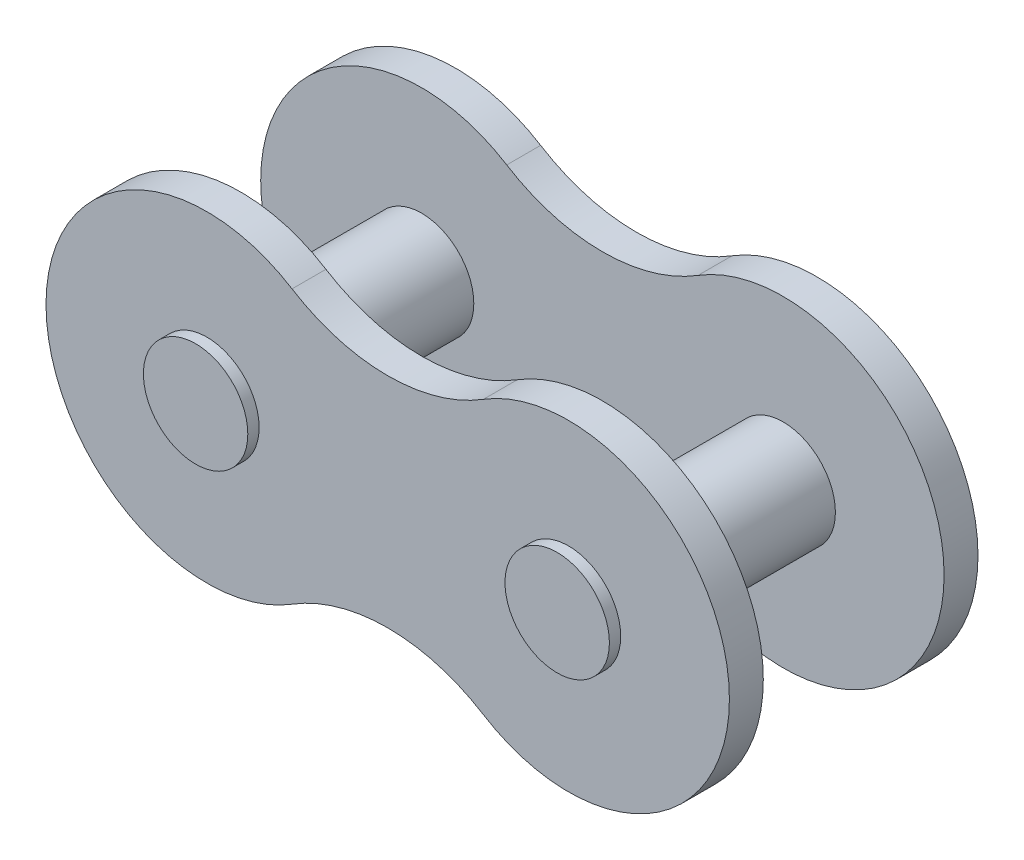
ISO-10303-21;
HEADER;
FILE_DESCRIPTION(('STEP AP214'),'2;1');
FILE_NAME('part.step','',(''),(''),'','','');
FILE_SCHEMA(('AUTOMOTIVE_DESIGN { 1 0 10303 214 1 1 1 1 }'));
ENDSEC;
DATA;
#1=APPLICATION_CONTEXT('core data for automotive mechanical design processes');
#2=APPLICATION_PROTOCOL_DEFINITION('international standard','automotive_design',2000,#1);
#3=PRODUCT_CONTEXT('',#1,'mechanical');
#4=PRODUCT('Part','Part','',(#3));
#5=PRODUCT_RELATED_PRODUCT_CATEGORY('part','',(#4));
#6=PRODUCT_DEFINITION_FORMATION('','',#4);
#7=PRODUCT_DEFINITION_CONTEXT('part definition',#1,'design');
#8=PRODUCT_DEFINITION('design','',#6,#7);
#9=PRODUCT_DEFINITION_SHAPE('','',#8);
#10=(LENGTH_UNIT() NAMED_UNIT(*) SI_UNIT(.MILLI.,.METRE.));
#11=(NAMED_UNIT(*) PLANE_ANGLE_UNIT() SI_UNIT($,.RADIAN.));
#12=(NAMED_UNIT(*) SI_UNIT($,.STERADIAN.) SOLID_ANGLE_UNIT());
#13=UNCERTAINTY_MEASURE_WITH_UNIT(LENGTH_MEASURE(1.E-05),#10,'distance_accuracy_value','');
#14=(GEOMETRIC_REPRESENTATION_CONTEXT(3) GLOBAL_UNCERTAINTY_ASSIGNED_CONTEXT((#13)) GLOBAL_UNIT_ASSIGNED_CONTEXT((#10,
#11,#12)) REPRESENTATION_CONTEXT('',''));
#15=CARTESIAN_POINT('',(0.,0.,0.));
#16=DIRECTION('',(0.,0.,1.));
#17=DIRECTION('',(1.,0.,0.));
#18=AXIS2_PLACEMENT_3D('',#15,#16,#17);
#19=CARTESIAN_POINT('',(-4.,0.,-0.25));
#20=DIRECTION('',(0.,0.,1.));
#21=DIRECTION('',(1.,0.,0.));
#22=AXIS2_PLACEMENT_3D('',#19,#20,#21);
#23=CYLINDRICAL_SURFACE('',#22,1.155);
#24=CARTESIAN_POINT('',(-4.,0.,0.75));
#25=DIRECTION('',(0.,0.,-1.));
#26=DIRECTION('',(-1.,0.,0.));
#27=AXIS2_PLACEMENT_3D('',#24,#25,#26);
#28=CIRCLE('',#27,1.155);
#29=CARTESIAN_POINT('',(-5.155,0.,0.75));
#30=VERTEX_POINT('',#29);
#31=EDGE_CURVE('E198',#30,#30,#28,.T.);
#32=ORIENTED_EDGE('',*,*,#31,.F.);
#33=EDGE_LOOP('',(#32));
#34=FACE_BOUND('',#33,.T.);
#35=CARTESIAN_POINT('',(-4.,0.,4.75));
#36=DIRECTION('',(0.,0.,1.));
#37=DIRECTION('',(1.,0.,0.));
#38=AXIS2_PLACEMENT_3D('',#35,#36,#37);
#39=CIRCLE('',#38,1.155);
#40=CARTESIAN_POINT('',(-2.845,0.,4.75));
#41=VERTEX_POINT('',#40);
#42=EDGE_CURVE('E174',#41,#41,#39,.F.);
#43=ORIENTED_EDGE('',*,*,#42,.T.);
#44=EDGE_LOOP('',(#43));
#45=FACE_BOUND('',#44,.T.);
#46=ADVANCED_FACE('F40',(#34,#45),#23,.T.);
#47=CARTESIAN_POINT('',(4.,0.,-0.25));
#48=DIRECTION('',(0.,0.,1.));
#49=DIRECTION('',(1.,0.,0.));
#50=AXIS2_PLACEMENT_3D('',#47,#48,#49);
#51=CYLINDRICAL_SURFACE('',#50,1.155);
#52=CARTESIAN_POINT('',(4.,0.,0.75));
#53=DIRECTION('',(0.,0.,-1.));
#54=DIRECTION('',(-1.,0.,0.));
#55=AXIS2_PLACEMENT_3D('',#52,#53,#54);
#56=CIRCLE('',#55,1.155);
#57=CARTESIAN_POINT('',(2.845,0.,0.75));
#58=VERTEX_POINT('',#57);
#59=EDGE_CURVE('E186',#58,#58,#56,.T.);
#60=ORIENTED_EDGE('',*,*,#59,.F.);
#61=EDGE_LOOP('',(#60));
#62=FACE_BOUND('',#61,.T.);
#63=CARTESIAN_POINT('',(4.,0.,4.75));
#64=DIRECTION('',(0.,0.,1.));
#65=DIRECTION('',(1.,0.,0.));
#66=AXIS2_PLACEMENT_3D('',#63,#64,#65);
#67=CIRCLE('',#66,1.155);
#68=CARTESIAN_POINT('',(5.155,0.,4.75));
#69=VERTEX_POINT('',#68);
#70=EDGE_CURVE('E44',#69,#69,#67,.F.);
#71=ORIENTED_EDGE('',*,*,#70,.T.);
#72=EDGE_LOOP('',(#71));
#73=FACE_BOUND('',#72,.T.);
#74=ADVANCED_FACE('F257',(#62,#73),#51,.T.);
#75=CARTESIAN_POINT('',(0.,6.41510716979849,0.75));
#76=DIRECTION('',(0.,0.,-1.));
#77=DIRECTION('',(-1.,0.,0.));
#78=AXIS2_PLACEMENT_3D('',#75,#76,#77);
#79=CYLINDRICAL_SURFACE('',#78,4.);
#80=CARTESIAN_POINT('',(0.,6.41510716979849,0.));
#81=DIRECTION('',(0.,0.,-1.));
#82=DIRECTION('',(-1.,0.,0.));
#83=AXIS2_PLACEMENT_3D('',#80,#81,#82);
#84=CIRCLE('',#83,4.);
#85=CARTESIAN_POINT('',(2.11640211640212,3.02087057202151,0.));
#86=VERTEX_POINT('',#85);
#87=CARTESIAN_POINT('',(-2.11640211640212,3.02087057202151,0.));
#88=VERTEX_POINT('',#87);
#89=EDGE_CURVE('E202',#86,#88,#84,.T.);
#90=ORIENTED_EDGE('',*,*,#89,.T.);
#91=DIRECTION('',(0.,0.,-1.));
#92=VECTOR('',#91,1.);
#93=CARTESIAN_POINT('',(-2.11640211640212,3.02087057202151,0.75));
#94=LINE('',#93,#92);
#95=CARTESIAN_POINT('',(-2.11640211640212,3.02087057202151,0.75));
#96=VERTEX_POINT('',#95);
#97=EDGE_CURVE('E232',#96,#88,#94,.T.);
#98=ORIENTED_EDGE('',*,*,#97,.F.);
#99=CARTESIAN_POINT('',(0.,6.41510716979849,0.75));
#100=DIRECTION('',(0.,0.,-1.));
#101=DIRECTION('',(-1.,0.,0.));
#102=AXIS2_PLACEMENT_3D('',#99,#100,#101);
#103=CIRCLE('',#102,4.);
#104=CARTESIAN_POINT('',(2.11640211640212,3.02087057202151,0.75));
#105=VERTEX_POINT('',#104);
#106=EDGE_CURVE('E203',#105,#96,#103,.T.);
#107=ORIENTED_EDGE('',*,*,#106,.F.);
#108=DIRECTION('',(0.,0.,-1.));
#109=VECTOR('',#108,1.);
#110=CARTESIAN_POINT('',(2.11640211640212,3.02087057202151,0.75));
#111=LINE('',#110,#109);
#112=EDGE_CURVE('E213',#105,#86,#111,.T.);
#113=ORIENTED_EDGE('',*,*,#112,.T.);
#114=EDGE_LOOP('',(#90,#98,#107,#113));
#115=FACE_BOUND('',#114,.T.);
#116=ADVANCED_FACE('F42',(#115),#79,.F.);
#117=CARTESIAN_POINT('',(-4.,0.,0.75));
#118=DIRECTION('',(0.,0.,-1.));
#119=DIRECTION('',(-1.,0.,0.));
#120=AXIS2_PLACEMENT_3D('',#117,#118,#119);
#121=CYLINDRICAL_SURFACE('',#120,3.56);
#122=CARTESIAN_POINT('',(-4.,0.,0.));
#123=DIRECTION('',(0.,0.,1.));
#124=DIRECTION('',(1.,0.,0.));
#125=AXIS2_PLACEMENT_3D('',#122,#123,#124);
#126=CIRCLE('',#125,3.56);
#127=CARTESIAN_POINT('',(-2.11640211640211,-3.02087057202151,0.));
#128=VERTEX_POINT('',#127);
#129=EDGE_CURVE('E217',#88,#128,#126,.T.);
#130=ORIENTED_EDGE('',*,*,#129,.T.);
#131=DIRECTION('',(0.,0.,-1.));
#132=VECTOR('',#131,1.);
#133=CARTESIAN_POINT('',(-2.11640211640211,-3.02087057202151,0.75));
#134=LINE('',#133,#132);
#135=CARTESIAN_POINT('',(-2.11640211640211,-3.02087057202151,0.75));
#136=VERTEX_POINT('',#135);
#137=EDGE_CURVE('E229',#136,#128,#134,.T.);
#138=ORIENTED_EDGE('',*,*,#137,.F.);
#139=CARTESIAN_POINT('',(-4.,0.,0.75));
#140=DIRECTION('',(0.,0.,1.));
#141=DIRECTION('',(1.,0.,0.));
#142=AXIS2_PLACEMENT_3D('',#139,#140,#141);
#143=CIRCLE('',#142,3.56);
#144=EDGE_CURVE('E92',#96,#136,#143,.T.);
#145=ORIENTED_EDGE('',*,*,#144,.F.);
#146=ORIENTED_EDGE('',*,*,#97,.T.);
#147=EDGE_LOOP('',(#130,#138,#145,#146));
#148=FACE_BOUND('',#147,.T.);
#149=ADVANCED_FACE('F311',(#148),#121,.T.);
#150=CARTESIAN_POINT('',(0.,-6.41510716979849,0.75));
#151=DIRECTION('',(0.,0.,-1.));
#152=DIRECTION('',(-1.,0.,0.));
#153=AXIS2_PLACEMENT_3D('',#150,#151,#152);
#154=CYLINDRICAL_SURFACE('',#153,4.);
#155=CARTESIAN_POINT('',(0.,-6.41510716979849,0.));
#156=DIRECTION('',(0.,0.,-1.));
#157=DIRECTION('',(1.,0.,0.));
#158=AXIS2_PLACEMENT_3D('',#155,#156,#157);
#159=CIRCLE('',#158,4.);
#160=CARTESIAN_POINT('',(2.11640211640212,-3.02087057202151,0.));
#161=VERTEX_POINT('',#160);
#162=EDGE_CURVE('E78',#128,#161,#159,.T.);
#163=ORIENTED_EDGE('',*,*,#162,.T.);
#164=DIRECTION('',(0.,0.,-1.));
#165=VECTOR('',#164,1.);
#166=CARTESIAN_POINT('',(2.11640211640212,-3.02087057202151,0.75));
#167=LINE('',#166,#165);
#168=CARTESIAN_POINT('',(2.11640211640212,-3.02087057202151,0.75));
#169=VERTEX_POINT('',#168);
#170=EDGE_CURVE('E226',#169,#161,#167,.T.);
#171=ORIENTED_EDGE('',*,*,#170,.F.);
#172=CARTESIAN_POINT('',(0.,-6.41510716979849,0.75));
#173=DIRECTION('',(0.,0.,-1.));
#174=DIRECTION('',(1.,0.,0.));
#175=AXIS2_PLACEMENT_3D('',#172,#173,#174);
#176=CIRCLE('',#175,4.);
#177=EDGE_CURVE('E208',#136,#169,#176,.T.);
#178=ORIENTED_EDGE('',*,*,#177,.F.);
#179=ORIENTED_EDGE('',*,*,#137,.T.);
#180=EDGE_LOOP('',(#163,#171,#178,#179));
#181=FACE_BOUND('',#180,.T.);
#182=ADVANCED_FACE('F310',(#181),#154,.F.);
#183=CARTESIAN_POINT('',(4.,0.,0.75));
#184=DIRECTION('',(0.,0.,-1.));
#185=DIRECTION('',(-1.,0.,0.));
#186=AXIS2_PLACEMENT_3D('',#183,#184,#185);
#187=CYLINDRICAL_SURFACE('',#186,3.56);
#188=CARTESIAN_POINT('',(4.,0.,0.));
#189=DIRECTION('',(0.,0.,1.));
#190=DIRECTION('',(1.,0.,0.));
#191=AXIS2_PLACEMENT_3D('',#188,#189,#190);
#192=CIRCLE('',#191,3.56);
#193=EDGE_CURVE('E84',#161,#86,#192,.T.);
#194=ORIENTED_EDGE('',*,*,#193,.T.);
#195=ORIENTED_EDGE('',*,*,#112,.F.);
#196=CARTESIAN_POINT('',(4.,0.,0.75));
#197=DIRECTION('',(0.,0.,1.));
#198=DIRECTION('',(1.,0.,0.));
#199=AXIS2_PLACEMENT_3D('',#196,#197,#198);
#200=CIRCLE('',#199,3.56);
#201=EDGE_CURVE('E60',#169,#105,#200,.T.);
#202=ORIENTED_EDGE('',*,*,#201,.F.);
#203=ORIENTED_EDGE('',*,*,#170,.T.);
#204=EDGE_LOOP('',(#194,#195,#202,#203));
#205=FACE_BOUND('',#204,.T.);
#206=ADVANCED_FACE('F308',(#205),#187,.T.);
#207=CARTESIAN_POINT('',(-2.,3.20755358489925,0.75));
#208=DIRECTION('',(0.,0.,-1.));
#209=DIRECTION('',(-1.,0.,0.));
#210=AXIS2_PLACEMENT_3D('',#207,#208,#209);
#211=PLANE('',#210);
#212=ORIENTED_EDGE('',*,*,#59,.T.);
#213=EDGE_LOOP('',(#212));
#214=FACE_BOUND('',#213,.T.);
#215=ORIENTED_EDGE('',*,*,#31,.T.);
#216=EDGE_LOOP('',(#215));
#217=FACE_BOUND('',#216,.T.);
#218=ORIENTED_EDGE('',*,*,#106,.T.);
#219=ORIENTED_EDGE('',*,*,#144,.T.);
#220=ORIENTED_EDGE('',*,*,#177,.T.);
#221=ORIENTED_EDGE('',*,*,#201,.T.);
#222=EDGE_LOOP('',(#218,#219,#220,#221));
#223=FACE_BOUND('',#222,.T.);
#224=ADVANCED_FACE('F301',(#214,#217,#223),#211,.F.);
#225=CARTESIAN_POINT('',(-2.,3.20755358489925,0.));
#226=DIRECTION('',(0.,0.,-1.));
#227=DIRECTION('',(-1.,0.,0.));
#228=AXIS2_PLACEMENT_3D('',#225,#226,#227);
#229=PLANE('',#228);
#230=CARTESIAN_POINT('',(4.,0.,0.));
#231=DIRECTION('',(0.,0.,-1.));
#232=DIRECTION('',(-1.,0.,0.));
#233=AXIS2_PLACEMENT_3D('',#230,#231,#232);
#234=CIRCLE('',#233,1.155);
#235=CARTESIAN_POINT('',(2.845,0.,0.));
#236=VERTEX_POINT('',#235);
#237=EDGE_CURVE('E239',#236,#236,#234,.T.);
#238=ORIENTED_EDGE('',*,*,#237,.F.);
#239=EDGE_LOOP('',(#238));
#240=FACE_BOUND('',#239,.T.);
#241=CARTESIAN_POINT('',(-4.,0.,0.));
#242=DIRECTION('',(0.,0.,-1.));
#243=DIRECTION('',(-1.,0.,0.));
#244=AXIS2_PLACEMENT_3D('',#241,#242,#243);
#245=CIRCLE('',#244,1.155);
#246=CARTESIAN_POINT('',(-5.155,0.,0.));
#247=VERTEX_POINT('',#246);
#248=EDGE_CURVE('E235',#247,#247,#245,.T.);
#249=ORIENTED_EDGE('',*,*,#248,.F.);
#250=EDGE_LOOP('',(#249));
#251=FACE_BOUND('',#250,.T.);
#252=ORIENTED_EDGE('',*,*,#89,.F.);
#253=ORIENTED_EDGE('',*,*,#193,.F.);
#254=ORIENTED_EDGE('',*,*,#162,.F.);
#255=ORIENTED_EDGE('',*,*,#129,.F.);
#256=EDGE_LOOP('',(#252,#253,#254,#255));
#257=FACE_BOUND('',#256,.T.);
#258=ADVANCED_FACE('F293',(#240,#251,#257),#229,.T.);
#259=CARTESIAN_POINT('',(-4.,0.,-0.25));
#260=DIRECTION('',(0.,0.,1.));
#261=DIRECTION('',(1.,0.,0.));
#262=AXIS2_PLACEMENT_3D('',#259,#260,#261);
#263=PLANE('',#262);
#264=CARTESIAN_POINT('',(-4.,0.,-0.25));
#265=DIRECTION('',(0.,0.,1.));
#266=DIRECTION('',(1.,0.,0.));
#267=AXIS2_PLACEMENT_3D('',#264,#265,#266);
#268=CIRCLE('',#267,1.155);
#269=CARTESIAN_POINT('',(-2.845,0.,-0.25));
#270=VERTEX_POINT('',#269);
#271=EDGE_CURVE('E194',#270,#270,#268,.T.);
#272=ORIENTED_EDGE('',*,*,#271,.F.);
#273=EDGE_LOOP('',(#272));
#274=FACE_BOUND('',#273,.T.);
#275=ADVANCED_FACE('F286',(#274),#263,.F.);
#276=ORIENTED_EDGE('',*,*,#248,.T.);
#277=EDGE_LOOP('',(#276));
#278=FACE_BOUND('',#277,.T.);
#279=ORIENTED_EDGE('',*,*,#271,.T.);
#280=EDGE_LOOP('',(#279));
#281=FACE_BOUND('',#280,.T.);
#282=ADVANCED_FACE('F273',(#278,#281),#23,.T.);
#283=CARTESIAN_POINT('',(4.,0.,-0.25));
#284=DIRECTION('',(0.,0.,1.));
#285=DIRECTION('',(1.,0.,0.));
#286=AXIS2_PLACEMENT_3D('',#283,#284,#285);
#287=PLANE('',#286);
#288=CARTESIAN_POINT('',(4.,0.,-0.25));
#289=DIRECTION('',(0.,0.,1.));
#290=DIRECTION('',(1.,0.,0.));
#291=AXIS2_PLACEMENT_3D('',#288,#289,#290);
#292=CIRCLE('',#291,1.155);
#293=CARTESIAN_POINT('',(5.155,0.,-0.25));
#294=VERTEX_POINT('',#293);
#295=EDGE_CURVE('E182',#294,#294,#292,.T.);
#296=ORIENTED_EDGE('',*,*,#295,.F.);
#297=EDGE_LOOP('',(#296));
#298=FACE_BOUND('',#297,.T.);
#299=ADVANCED_FACE('F285',(#298),#287,.F.);
#300=ORIENTED_EDGE('',*,*,#237,.T.);
#301=EDGE_LOOP('',(#300));
#302=FACE_BOUND('',#301,.T.);
#303=ORIENTED_EDGE('',*,*,#295,.T.);
#304=EDGE_LOOP('',(#303));
#305=FACE_BOUND('',#304,.T.);
#306=ADVANCED_FACE('F256',(#302,#305),#51,.T.);
#307=CARTESIAN_POINT('',(0.,6.41510716979849,4.75));
#308=DIRECTION('',(0.,0.,1.));
#309=DIRECTION('',(1.,0.,0.));
#310=AXIS2_PLACEMENT_3D('',#307,#308,#309);
#311=CYLINDRICAL_SURFACE('',#310,4.);
#312=CARTESIAN_POINT('',(0.,6.41510716979849,5.5));
#313=DIRECTION('',(0.,0.,-1.));
#314=DIRECTION('',(-1.,0.,0.));
#315=AXIS2_PLACEMENT_3D('',#312,#313,#314);
#316=CIRCLE('',#315,4.);
#317=CARTESIAN_POINT('',(2.11640211640212,3.02087057202151,5.5));
#318=VERTEX_POINT('',#317);
#319=CARTESIAN_POINT('',(-2.11640211640212,3.02087057202151,5.5));
#320=VERTEX_POINT('',#319);
#321=EDGE_CURVE('E125',#318,#320,#316,.T.);
#322=ORIENTED_EDGE('',*,*,#321,.F.);
#323=DIRECTION('',(0.,0.,1.));
#324=VECTOR('',#323,1.);
#325=CARTESIAN_POINT('',(2.11640211640212,3.02087057202151,4.75));
#326=LINE('',#325,#324);
#327=CARTESIAN_POINT('',(2.11640211640212,3.02087057202151,4.75));
#328=VERTEX_POINT('',#327);
#329=EDGE_CURVE('E119',#328,#318,#326,.T.);
#330=ORIENTED_EDGE('',*,*,#329,.F.);
#331=CARTESIAN_POINT('',(0.,6.41510716979849,4.75));
#332=DIRECTION('',(0.,0.,-1.));
#333=DIRECTION('',(-1.,0.,0.));
#334=AXIS2_PLACEMENT_3D('',#331,#332,#333);
#335=CIRCLE('',#334,4.);
#336=CARTESIAN_POINT('',(-2.11640211640212,3.02087057202151,4.75));
#337=VERTEX_POINT('',#336);
#338=EDGE_CURVE('E122',#328,#337,#335,.T.);
#339=ORIENTED_EDGE('',*,*,#338,.T.);
#340=DIRECTION('',(0.,0.,1.));
#341=VECTOR('',#340,1.);
#342=CARTESIAN_POINT('',(-2.11640211640212,3.02087057202151,4.75));
#343=LINE('',#342,#341);
#344=EDGE_CURVE('E154',#337,#320,#343,.T.);
#345=ORIENTED_EDGE('',*,*,#344,.T.);
#346=EDGE_LOOP('',(#322,#330,#339,#345));
#347=FACE_BOUND('',#346,.T.);
#348=ADVANCED_FACE('F121',(#347),#311,.F.);
#349=CARTESIAN_POINT('',(4.,0.,4.75));
#350=DIRECTION('',(0.,0.,1.));
#351=DIRECTION('',(1.,0.,0.));
#352=AXIS2_PLACEMENT_3D('',#349,#350,#351);
#353=CYLINDRICAL_SURFACE('',#352,3.56);
#354=CARTESIAN_POINT('',(4.,0.,5.5));
#355=DIRECTION('',(0.,0.,1.));
#356=DIRECTION('',(1.,0.,0.));
#357=AXIS2_PLACEMENT_3D('',#354,#355,#356);
#358=CIRCLE('',#357,3.56);
#359=CARTESIAN_POINT('',(2.11640211640212,-3.02087057202151,5.5));
#360=VERTEX_POINT('',#359);
#361=EDGE_CURVE('E157',#360,#318,#358,.T.);
#362=ORIENTED_EDGE('',*,*,#361,.F.);
#363=DIRECTION('',(0.,0.,1.));
#364=VECTOR('',#363,1.);
#365=CARTESIAN_POINT('',(2.11640211640212,-3.02087057202151,4.75));
#366=LINE('',#365,#364);
#367=CARTESIAN_POINT('',(2.11640211640212,-3.02087057202151,4.75));
#368=VERTEX_POINT('',#367);
#369=EDGE_CURVE('E131',#368,#360,#366,.T.);
#370=ORIENTED_EDGE('',*,*,#369,.F.);
#371=CARTESIAN_POINT('',(4.,0.,4.75));
#372=DIRECTION('',(0.,0.,1.));
#373=DIRECTION('',(1.,0.,0.));
#374=AXIS2_PLACEMENT_3D('',#371,#372,#373);
#375=CIRCLE('',#374,3.56);
#376=EDGE_CURVE('E137',#368,#328,#375,.T.);
#377=ORIENTED_EDGE('',*,*,#376,.T.);
#378=ORIENTED_EDGE('',*,*,#329,.T.);
#379=EDGE_LOOP('',(#362,#370,#377,#378));
#380=FACE_BOUND('',#379,.T.);
#381=ADVANCED_FACE('F144',(#380),#353,.T.);
#382=CARTESIAN_POINT('',(0.,-6.41510716979849,4.75));
#383=DIRECTION('',(0.,0.,1.));
#384=DIRECTION('',(1.,0.,0.));
#385=AXIS2_PLACEMENT_3D('',#382,#383,#384);
#386=CYLINDRICAL_SURFACE('',#385,4.);
#387=CARTESIAN_POINT('',(0.,-6.41510716979849,5.5));
#388=DIRECTION('',(0.,0.,-1.));
#389=DIRECTION('',(1.,0.,0.));
#390=AXIS2_PLACEMENT_3D('',#387,#388,#389);
#391=CIRCLE('',#390,4.);
#392=CARTESIAN_POINT('',(-2.11640211640211,-3.02087057202151,5.5));
#393=VERTEX_POINT('',#392);
#394=EDGE_CURVE('E160',#393,#360,#391,.T.);
#395=ORIENTED_EDGE('',*,*,#394,.F.);
#396=DIRECTION('',(0.,0.,1.));
#397=VECTOR('',#396,1.);
#398=CARTESIAN_POINT('',(-2.11640211640211,-3.02087057202151,4.75));
#399=LINE('',#398,#397);
#400=CARTESIAN_POINT('',(-2.11640211640211,-3.02087057202151,4.75));
#401=VERTEX_POINT('',#400);
#402=EDGE_CURVE('E169',#401,#393,#399,.T.);
#403=ORIENTED_EDGE('',*,*,#402,.F.);
#404=CARTESIAN_POINT('',(0.,-6.41510716979849,4.75));
#405=DIRECTION('',(0.,0.,-1.));
#406=DIRECTION('',(1.,0.,0.));
#407=AXIS2_PLACEMENT_3D('',#404,#405,#406);
#408=CIRCLE('',#407,4.);
#409=EDGE_CURVE('E146',#401,#368,#408,.T.);
#410=ORIENTED_EDGE('',*,*,#409,.T.);
#411=ORIENTED_EDGE('',*,*,#369,.T.);
#412=EDGE_LOOP('',(#395,#403,#410,#411));
#413=FACE_BOUND('',#412,.T.);
#414=ADVANCED_FACE('F366',(#413),#386,.F.);
#415=CARTESIAN_POINT('',(-4.,0.,4.75));
#416=DIRECTION('',(0.,0.,1.));
#417=DIRECTION('',(1.,0.,0.));
#418=AXIS2_PLACEMENT_3D('',#415,#416,#417);
#419=CYLINDRICAL_SURFACE('',#418,3.56);
#420=CARTESIAN_POINT('',(-4.,0.,5.5));
#421=DIRECTION('',(0.,0.,1.));
#422=DIRECTION('',(1.,0.,0.));
#423=AXIS2_PLACEMENT_3D('',#420,#421,#422);
#424=CIRCLE('',#423,3.56);
#425=EDGE_CURVE('E142',#320,#393,#424,.T.);
#426=ORIENTED_EDGE('',*,*,#425,.F.);
#427=ORIENTED_EDGE('',*,*,#344,.F.);
#428=CARTESIAN_POINT('',(-4.,0.,4.75));
#429=DIRECTION('',(0.,0.,1.));
#430=DIRECTION('',(1.,0.,0.));
#431=AXIS2_PLACEMENT_3D('',#428,#429,#430);
#432=CIRCLE('',#431,3.56);
#433=EDGE_CURVE('E140',#337,#401,#432,.T.);
#434=ORIENTED_EDGE('',*,*,#433,.T.);
#435=ORIENTED_EDGE('',*,*,#402,.T.);
#436=EDGE_LOOP('',(#426,#427,#434,#435));
#437=FACE_BOUND('',#436,.T.);
#438=ADVANCED_FACE('F360',(#437),#419,.T.);
#439=CARTESIAN_POINT('',(-2.,3.20755358489925,4.75));
#440=DIRECTION('',(0.,0.,1.));
#441=DIRECTION('',(-1.,0.,0.));
#442=AXIS2_PLACEMENT_3D('',#439,#440,#441);
#443=PLANE('',#442);
#444=ORIENTED_EDGE('',*,*,#42,.F.);
#445=EDGE_LOOP('',(#444));
#446=FACE_BOUND('',#445,.T.);
#447=ORIENTED_EDGE('',*,*,#70,.F.);
#448=EDGE_LOOP('',(#447));
#449=FACE_BOUND('',#448,.T.);
#450=ORIENTED_EDGE('',*,*,#338,.F.);
#451=ORIENTED_EDGE('',*,*,#376,.F.);
#452=ORIENTED_EDGE('',*,*,#409,.F.);
#453=ORIENTED_EDGE('',*,*,#433,.F.);
#454=EDGE_LOOP('',(#450,#451,#452,#453));
#455=FACE_BOUND('',#454,.T.);
#456=ADVANCED_FACE('F135',(#446,#449,#455),#443,.F.);
#457=CARTESIAN_POINT('',(-2.,3.20755358489925,5.5));
#458=DIRECTION('',(0.,0.,1.));
#459=DIRECTION('',(-1.,0.,0.));
#460=AXIS2_PLACEMENT_3D('',#457,#458,#459);
#461=PLANE('',#460);
#462=CARTESIAN_POINT('',(-4.,0.,5.5));
#463=DIRECTION('',(0.,0.,1.));
#464=DIRECTION('',(1.,0.,0.));
#465=AXIS2_PLACEMENT_3D('',#462,#463,#464);
#466=CIRCLE('',#465,1.155);
#467=CARTESIAN_POINT('',(-2.845,0.,5.5));
#468=VERTEX_POINT('',#467);
#469=EDGE_CURVE('E11',#468,#468,#466,.F.);
#470=ORIENTED_EDGE('',*,*,#469,.T.);
#471=EDGE_LOOP('',(#470));
#472=FACE_BOUND('',#471,.T.);
#473=CARTESIAN_POINT('',(4.,0.,5.5));
#474=DIRECTION('',(0.,0.,1.));
#475=DIRECTION('',(1.,0.,0.));
#476=AXIS2_PLACEMENT_3D('',#473,#474,#475);
#477=CIRCLE('',#476,1.155);
#478=CARTESIAN_POINT('',(5.155,0.,5.5));
#479=VERTEX_POINT('',#478);
#480=EDGE_CURVE('E51',#479,#479,#477,.F.);
#481=ORIENTED_EDGE('',*,*,#480,.T.);
#482=EDGE_LOOP('',(#481));
#483=FACE_BOUND('',#482,.T.);
#484=ORIENTED_EDGE('',*,*,#321,.T.);
#485=ORIENTED_EDGE('',*,*,#425,.T.);
#486=ORIENTED_EDGE('',*,*,#394,.T.);
#487=ORIENTED_EDGE('',*,*,#361,.T.);
#488=EDGE_LOOP('',(#484,#485,#486,#487));
#489=FACE_BOUND('',#488,.T.);
#490=ADVANCED_FACE('F247',(#472,#483,#489),#461,.T.);
#491=CARTESIAN_POINT('',(4.,0.,5.75));
#492=DIRECTION('',(0.,0.,1.));
#493=DIRECTION('',(1.,0.,0.));
#494=AXIS2_PLACEMENT_3D('',#491,#492,#493);
#495=PLANE('',#494);
#496=CARTESIAN_POINT('',(4.,0.,5.75));
#497=DIRECTION('',(0.,0.,1.));
#498=DIRECTION('',(1.,0.,0.));
#499=AXIS2_PLACEMENT_3D('',#496,#497,#498);
#500=CIRCLE('',#499,1.155);
#501=CARTESIAN_POINT('',(5.155,0.,5.75));
#502=VERTEX_POINT('',#501);
#503=EDGE_CURVE('E178',#502,#502,#500,.T.);
#504=ORIENTED_EDGE('',*,*,#503,.T.);
#505=EDGE_LOOP('',(#504));
#506=FACE_BOUND('',#505,.T.);
#507=ADVANCED_FACE('F254',(#506),#495,.T.);
#508=ORIENTED_EDGE('',*,*,#480,.F.);
#509=EDGE_LOOP('',(#508));
#510=FACE_BOUND('',#509,.T.);
#511=ORIENTED_EDGE('',*,*,#503,.F.);
#512=EDGE_LOOP('',(#511));
#513=FACE_BOUND('',#512,.T.);
#514=ADVANCED_FACE('F250',(#510,#513),#51,.T.);
#515=CARTESIAN_POINT('',(-4.,0.,5.75));
#516=DIRECTION('',(0.,0.,1.));
#517=DIRECTION('',(1.,0.,0.));
#518=AXIS2_PLACEMENT_3D('',#515,#516,#517);
#519=PLANE('',#518);
#520=CARTESIAN_POINT('',(-4.,0.,5.75));
#521=DIRECTION('',(0.,0.,1.));
#522=DIRECTION('',(1.,0.,0.));
#523=AXIS2_PLACEMENT_3D('',#520,#521,#522);
#524=CIRCLE('',#523,1.155);
#525=CARTESIAN_POINT('',(-2.845,0.,5.75));
#526=VERTEX_POINT('',#525);
#527=EDGE_CURVE('E190',#526,#526,#524,.T.);
#528=ORIENTED_EDGE('',*,*,#527,.T.);
#529=EDGE_LOOP('',(#528));
#530=FACE_BOUND('',#529,.T.);
#531=ADVANCED_FACE('F253',(#530),#519,.T.);
#532=ORIENTED_EDGE('',*,*,#469,.F.);
#533=EDGE_LOOP('',(#532));
#534=FACE_BOUND('',#533,.T.);
#535=ORIENTED_EDGE('',*,*,#527,.F.);
#536=EDGE_LOOP('',(#535));
#537=FACE_BOUND('',#536,.T.);
#538=ADVANCED_FACE('F272',(#534,#537),#23,.T.);
#539=CLOSED_SHELL('',(#46,#74,#116,#149,#182,#206,#224,#258,#275,#282,#299,#306,#348,#381,#414,
#438,#456,#490,#507,#514,#531,#538));
#540=MANIFOLD_SOLID_BREP('B2',#539);
#541=ADVANCED_BREP_SHAPE_REPRESENTATION('',(#18,#540),#14);
#542=SHAPE_DEFINITION_REPRESENTATION(#9,#541);
ENDSEC;
END-ISO-10303-21;
